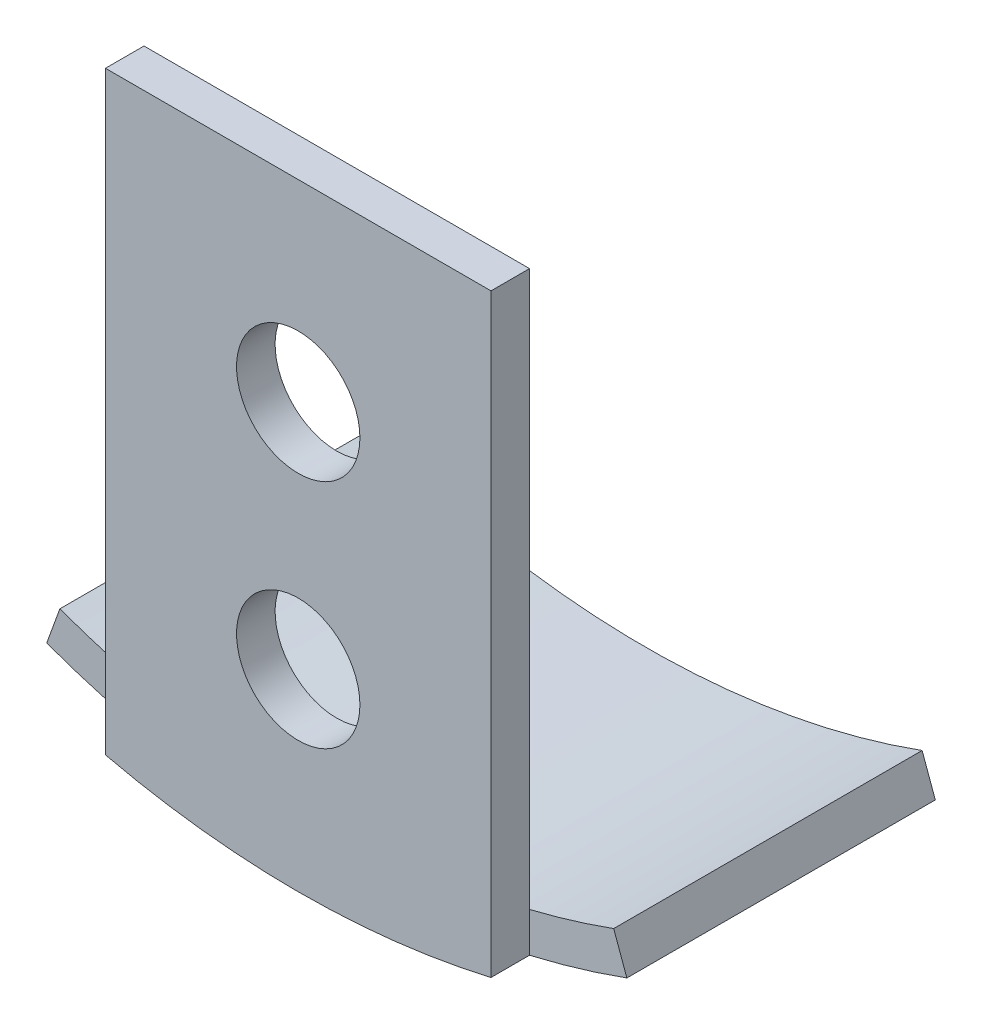
ISO-10303-21;
HEADER;
FILE_DESCRIPTION(('STEP AP214'),'2;1');
FILE_NAME('part.step','',(''),(''),'','','');
FILE_SCHEMA(('AUTOMOTIVE_DESIGN { 1 0 10303 214 1 1 1 1 }'));
ENDSEC;
DATA;
#1=APPLICATION_CONTEXT('core data for automotive mechanical design processes');
#2=APPLICATION_PROTOCOL_DEFINITION('international standard','automotive_design',2000,#1);
#3=PRODUCT_CONTEXT('',#1,'mechanical');
#4=PRODUCT('Part','Part','',(#3));
#5=PRODUCT_RELATED_PRODUCT_CATEGORY('part','',(#4));
#6=PRODUCT_DEFINITION_FORMATION('','',#4);
#7=PRODUCT_DEFINITION_CONTEXT('part definition',#1,'design');
#8=PRODUCT_DEFINITION('design','',#6,#7);
#9=PRODUCT_DEFINITION_SHAPE('','',#8);
#10=(LENGTH_UNIT() NAMED_UNIT(*) SI_UNIT(.MILLI.,.METRE.));
#11=(NAMED_UNIT(*) PLANE_ANGLE_UNIT() SI_UNIT($,.RADIAN.));
#12=(NAMED_UNIT(*) SI_UNIT($,.STERADIAN.) SOLID_ANGLE_UNIT());
#13=UNCERTAINTY_MEASURE_WITH_UNIT(LENGTH_MEASURE(1.E-05),#10,'distance_accuracy_value','');
#14=(GEOMETRIC_REPRESENTATION_CONTEXT(3) GLOBAL_UNCERTAINTY_ASSIGNED_CONTEXT((#13)) GLOBAL_UNIT_ASSIGNED_CONTEXT((#10,
#11,#12)) REPRESENTATION_CONTEXT('',''));
#15=CARTESIAN_POINT('',(0.,0.,0.));
#16=DIRECTION('',(0.,0.,1.));
#17=DIRECTION('',(1.,0.,0.));
#18=AXIS2_PLACEMENT_3D('',#15,#16,#17);
#19=CARTESIAN_POINT('',(10.,16.,0.));
#20=DIRECTION('',(0.,0.,-1.));
#21=DIRECTION('',(0.,1.,0.));
#22=AXIS2_PLACEMENT_3D('',#19,#20,#21);
#23=PLANE('',#22);
#24=CARTESIAN_POINT('',(5.,5.,0.));
#25=DIRECTION('',(0.,0.,1.));
#26=DIRECTION('',(1.,0.,0.));
#27=AXIS2_PLACEMENT_3D('',#24,#25,#26);
#28=CIRCLE('',#27,1.6);
#29=CARTESIAN_POINT('',(6.6,5.,0.));
#30=VERTEX_POINT('',#29);
#31=EDGE_CURVE('E147',#30,#30,#28,.T.);
#32=ORIENTED_EDGE('',*,*,#31,.F.);
#33=EDGE_LOOP('',(#32));
#34=FACE_BOUND('',#33,.T.);
#35=CARTESIAN_POINT('',(5.,11.,0.));
#36=DIRECTION('',(0.,0.,1.));
#37=DIRECTION('',(1.,0.,0.));
#38=AXIS2_PLACEMENT_3D('',#35,#36,#37);
#39=CIRCLE('',#38,1.6);
#40=CARTESIAN_POINT('',(6.6,11.,0.));
#41=VERTEX_POINT('',#40);
#42=EDGE_CURVE('E150',#41,#41,#39,.T.);
#43=ORIENTED_EDGE('',*,*,#42,.F.);
#44=EDGE_LOOP('',(#43));
#45=FACE_BOUND('',#44,.T.);
#46=CARTESIAN_POINT('',(5.,22.,0.));
#47=DIRECTION('',(0.,0.,-1.));
#48=DIRECTION('',(0.,1.,0.));
#49=AXIS2_PLACEMENT_3D('',#46,#47,#48);
#50=CIRCLE('',#49,22.);
#51=CARTESIAN_POINT('',(10.,0.575714714371449,0.));
#52=VERTEX_POINT('',#51);
#53=CARTESIAN_POINT('',(0.,0.575714714371449,0.));
#54=VERTEX_POINT('',#53);
#55=EDGE_CURVE('E114',#52,#54,#50,.T.);
#56=ORIENTED_EDGE('',*,*,#55,.F.);
#57=DIRECTION('',(0.,-1.,0.));
#58=VECTOR('',#57,1.);
#59=CARTESIAN_POINT('',(10.,16.,0.));
#60=LINE('',#59,#58);
#61=CARTESIAN_POINT('',(10.,16.,0.));
#62=VERTEX_POINT('',#61);
#63=EDGE_CURVE('E110',#62,#52,#60,.T.);
#64=ORIENTED_EDGE('',*,*,#63,.F.);
#65=DIRECTION('',(-1.,0.,0.));
#66=VECTOR('',#65,1.);
#67=CARTESIAN_POINT('',(10.,16.,0.));
#68=LINE('',#67,#66);
#69=CARTESIAN_POINT('',(0.,16.,0.));
#70=VERTEX_POINT('',#69);
#71=EDGE_CURVE('E157',#62,#70,#68,.T.);
#72=ORIENTED_EDGE('',*,*,#71,.T.);
#73=DIRECTION('',(0.,-1.,0.));
#74=VECTOR('',#73,1.);
#75=CARTESIAN_POINT('',(0.,16.,0.));
#76=LINE('',#75,#74);
#77=EDGE_CURVE('E158',#70,#54,#76,.T.);
#78=ORIENTED_EDGE('',*,*,#77,.T.);
#79=EDGE_LOOP('',(#56,#64,#72,#78));
#80=FACE_BOUND('',#79,.T.);
#81=ADVANCED_FACE('F34',(#34,#45,#80),#23,.F.);
#82=CARTESIAN_POINT('',(10.,0.,0.));
#83=DIRECTION('',(1.,0.,0.));
#84=DIRECTION('',(0.,0.,-1.));
#85=AXIS2_PLACEMENT_3D('',#82,#83,#84);
#86=PLANE('',#85);
#87=ORIENTED_EDGE('',*,*,#63,.T.);
#88=DIRECTION('',(0.,0.,-1.));
#89=VECTOR('',#88,1.);
#90=CARTESIAN_POINT('',(10.,0.575714714371449,7.));
#91=LINE('',#90,#89);
#92=CARTESIAN_POINT('',(10.,0.575714714371449,-1.));
#93=VERTEX_POINT('',#92);
#94=EDGE_CURVE('E104',#52,#93,#91,.T.);
#95=ORIENTED_EDGE('',*,*,#94,.T.);
#96=DIRECTION('',(0.,1.,0.));
#97=VECTOR('',#96,1.);
#98=CARTESIAN_POINT('',(10.,1.,-1.));
#99=LINE('',#98,#97);
#100=CARTESIAN_POINT('',(10.,1.60392194562886,-1.));
#101=VERTEX_POINT('',#100);
#102=EDGE_CURVE('E107',#93,#101,#99,.T.);
#103=ORIENTED_EDGE('',*,*,#102,.T.);
#104=CARTESIAN_POINT('',(10.,16.,-1.));
#105=VERTEX_POINT('',#104);
#106=EDGE_CURVE('E52',#101,#105,#99,.T.);
#107=ORIENTED_EDGE('',*,*,#106,.T.);
#108=DIRECTION('',(0.,0.,1.));
#109=VECTOR('',#108,1.);
#110=CARTESIAN_POINT('',(10.,16.,-1.));
#111=LINE('',#110,#109);
#112=EDGE_CURVE('E121',#105,#62,#111,.T.);
#113=ORIENTED_EDGE('',*,*,#112,.T.);
#114=EDGE_LOOP('',(#87,#95,#103,#107,#113));
#115=FACE_BOUND('',#114,.T.);
#116=ADVANCED_FACE('F106',(#115),#86,.T.);
#117=CARTESIAN_POINT('',(0.,0.,0.));
#118=DIRECTION('',(1.,0.,0.));
#119=DIRECTION('',(0.,0.,-1.));
#120=AXIS2_PLACEMENT_3D('',#117,#118,#119);
#121=PLANE('',#120);
#122=DIRECTION('',(0.,0.,-1.));
#123=VECTOR('',#122,1.);
#124=CARTESIAN_POINT('',(0.,0.575714714371449,7.));
#125=LINE('',#124,#123);
#126=CARTESIAN_POINT('',(0.,0.575714714371449,-1.));
#127=VERTEX_POINT('',#126);
#128=EDGE_CURVE('E201',#54,#127,#125,.T.);
#129=ORIENTED_EDGE('',*,*,#128,.F.);
#130=ORIENTED_EDGE('',*,*,#77,.F.);
#131=DIRECTION('',(0.,0.,1.));
#132=VECTOR('',#131,1.);
#133=CARTESIAN_POINT('',(0.,16.,-1.));
#134=LINE('',#133,#132);
#135=CARTESIAN_POINT('',(0.,16.,-1.));
#136=VERTEX_POINT('',#135);
#137=EDGE_CURVE('E154',#136,#70,#134,.T.);
#138=ORIENTED_EDGE('',*,*,#137,.F.);
#139=DIRECTION('',(0.,1.,0.));
#140=VECTOR('',#139,1.);
#141=CARTESIAN_POINT('',(0.,1.,-1.));
#142=LINE('',#141,#140);
#143=CARTESIAN_POINT('',(0.,1.60392194562886,-1.));
#144=VERTEX_POINT('',#143);
#145=EDGE_CURVE('E161',#144,#136,#142,.T.);
#146=ORIENTED_EDGE('',*,*,#145,.F.);
#147=EDGE_CURVE('E163',#127,#144,#142,.T.);
#148=ORIENTED_EDGE('',*,*,#147,.F.);
#149=EDGE_LOOP('',(#129,#130,#138,#146,#148));
#150=FACE_BOUND('',#149,.T.);
#151=ADVANCED_FACE('F194',(#150),#121,.F.);
#152=CARTESIAN_POINT('',(10.,1.,-1.));
#153=DIRECTION('',(0.,0.,1.));
#154=DIRECTION('',(0.,-1.,0.));
#155=AXIS2_PLACEMENT_3D('',#152,#153,#154);
#156=PLANE('',#155);
#157=CARTESIAN_POINT('',(5.,22.,-1.));
#158=DIRECTION('',(0.,0.,1.));
#159=DIRECTION('',(0.,1.,0.));
#160=AXIS2_PLACEMENT_3D('',#157,#158,#159);
#161=CIRCLE('',#160,21.);
#162=EDGE_CURVE('E12',#144,#101,#161,.T.);
#163=ORIENTED_EDGE('',*,*,#162,.F.);
#164=ORIENTED_EDGE('',*,*,#145,.T.);
#165=DIRECTION('',(-1.,0.,0.));
#166=VECTOR('',#165,1.);
#167=CARTESIAN_POINT('',(10.,16.,-1.));
#168=LINE('',#167,#166);
#169=EDGE_CURVE('E42',#105,#136,#168,.T.);
#170=ORIENTED_EDGE('',*,*,#169,.F.);
#171=ORIENTED_EDGE('',*,*,#106,.F.);
#172=EDGE_LOOP('',(#163,#164,#170,#171));
#173=FACE_BOUND('',#172,.T.);
#174=CARTESIAN_POINT('',(5.,5.,-1.));
#175=DIRECTION('',(0.,0.,1.));
#176=DIRECTION('',(0.,-1.,0.));
#177=AXIS2_PLACEMENT_3D('',#174,#175,#176);
#178=CIRCLE('',#177,1.6);
#179=CARTESIAN_POINT('',(5.,3.4,-1.));
#180=VERTEX_POINT('',#179);
#181=EDGE_CURVE('E37',#180,#180,#178,.T.);
#182=ORIENTED_EDGE('',*,*,#181,.T.);
#183=EDGE_LOOP('',(#182));
#184=FACE_BOUND('',#183,.T.);
#185=CARTESIAN_POINT('',(5.,11.,-1.));
#186=DIRECTION('',(0.,0.,1.));
#187=DIRECTION('',(0.,-1.,0.));
#188=AXIS2_PLACEMENT_3D('',#185,#186,#187);
#189=CIRCLE('',#188,1.6);
#190=CARTESIAN_POINT('',(5.,9.4,-1.));
#191=VERTEX_POINT('',#190);
#192=EDGE_CURVE('E153',#191,#191,#189,.T.);
#193=ORIENTED_EDGE('',*,*,#192,.T.);
#194=EDGE_LOOP('',(#193));
#195=FACE_BOUND('',#194,.T.);
#196=ADVANCED_FACE('F171',(#173,#184,#195),#156,.F.);
#197=CARTESIAN_POINT('',(10.,16.,-1.));
#198=DIRECTION('',(0.,-1.,0.));
#199=DIRECTION('',(0.,0.,-1.));
#200=AXIS2_PLACEMENT_3D('',#197,#198,#199);
#201=PLANE('',#200);
#202=ORIENTED_EDGE('',*,*,#137,.T.);
#203=ORIENTED_EDGE('',*,*,#71,.F.);
#204=ORIENTED_EDGE('',*,*,#112,.F.);
#205=ORIENTED_EDGE('',*,*,#169,.T.);
#206=EDGE_LOOP('',(#202,#203,#204,#205));
#207=FACE_BOUND('',#206,.T.);
#208=ADVANCED_FACE('F176',(#207),#201,.F.);
#209=CARTESIAN_POINT('',(5.,11.,-6.));
#210=DIRECTION('',(0.,0.,1.));
#211=DIRECTION('',(1.,0.,0.));
#212=AXIS2_PLACEMENT_3D('',#209,#210,#211);
#213=CYLINDRICAL_SURFACE('',#212,1.6);
#214=ORIENTED_EDGE('',*,*,#42,.T.);
#215=EDGE_LOOP('',(#214));
#216=FACE_BOUND('',#215,.T.);
#217=ORIENTED_EDGE('',*,*,#192,.F.);
#218=EDGE_LOOP('',(#217));
#219=FACE_BOUND('',#218,.T.);
#220=ADVANCED_FACE('F173',(#216,#219),#213,.F.);
#221=CARTESIAN_POINT('',(5.,5.,-6.));
#222=DIRECTION('',(0.,0.,1.));
#223=DIRECTION('',(1.,0.,0.));
#224=AXIS2_PLACEMENT_3D('',#221,#222,#223);
#225=CYLINDRICAL_SURFACE('',#224,1.6);
#226=ORIENTED_EDGE('',*,*,#31,.T.);
#227=EDGE_LOOP('',(#226));
#228=FACE_BOUND('',#227,.T.);
#229=ORIENTED_EDGE('',*,*,#181,.F.);
#230=EDGE_LOOP('',(#229));
#231=FACE_BOUND('',#230,.T.);
#232=ADVANCED_FACE('F175',(#228,#231),#225,.F.);
#233=CARTESIAN_POINT('',(5.,22.,-1.));
#234=DIRECTION('',(0.,0.,-1.));
#235=DIRECTION('',(0.,1.,0.));
#236=AXIS2_PLACEMENT_3D('',#233,#234,#235);
#237=PLANE('',#236);
#238=CARTESIAN_POINT('',(5.,22.,-1.));
#239=DIRECTION('',(0.,0.,-1.));
#240=DIRECTION('',(0.,1.,0.));
#241=AXIS2_PLACEMENT_3D('',#238,#239,#240);
#242=CIRCLE('',#241,22.);
#243=CARTESIAN_POINT('',(-2.52444315316473,1.32676234271003,-1.));
#244=VERTEX_POINT('',#243);
#245=EDGE_CURVE('E129',#127,#244,#242,.T.);
#246=ORIENTED_EDGE('',*,*,#245,.F.);
#247=ORIENTED_EDGE('',*,*,#147,.T.);
#248=CARTESIAN_POINT('',(-2.18242300983906,2.26645496349593,-1.));
#249=VERTEX_POINT('',#248);
#250=EDGE_CURVE('E44',#249,#144,#161,.T.);
#251=ORIENTED_EDGE('',*,*,#250,.F.);
#252=DIRECTION('',(0.34202014332567,0.939692620785908,0.));
#253=VECTOR('',#252,1.);
#254=CARTESIAN_POINT('',(-2.52444315316473,1.32676234271003,-1.));
#255=LINE('',#254,#253);
#256=EDGE_CURVE('E128',#244,#249,#255,.T.);
#257=ORIENTED_EDGE('',*,*,#256,.F.);
#258=EDGE_LOOP('',(#246,#247,#251,#257));
#259=FACE_BOUND('',#258,.T.);
#260=ADVANCED_FACE('F183',(#259),#237,.F.);
#261=CARTESIAN_POINT('',(5.,22.,-9.));
#262=DIRECTION('',(0.,0.,1.));
#263=DIRECTION('',(0.,-1.,0.));
#264=AXIS2_PLACEMENT_3D('',#261,#262,#263);
#265=CYLINDRICAL_SURFACE('',#264,21.);
#266=ORIENTED_EDGE('',*,*,#250,.T.);
#267=ORIENTED_EDGE('',*,*,#162,.T.);
#268=CARTESIAN_POINT('',(12.1824230098391,2.26645496349593,-1.));
#269=VERTEX_POINT('',#268);
#270=EDGE_CURVE('E45',#101,#269,#161,.T.);
#271=ORIENTED_EDGE('',*,*,#270,.T.);
#272=DIRECTION('',(0.,0.,1.));
#273=VECTOR('',#272,1.);
#274=CARTESIAN_POINT('',(12.1824230098391,2.26645496349593,-9.));
#275=LINE('',#274,#273);
#276=CARTESIAN_POINT('',(12.1824230098391,2.26645496349593,-9.));
#277=VERTEX_POINT('',#276);
#278=EDGE_CURVE('E144',#277,#269,#275,.T.);
#279=ORIENTED_EDGE('',*,*,#278,.F.);
#280=CARTESIAN_POINT('',(5.,22.,-9.));
#281=DIRECTION('',(0.,0.,1.));
#282=DIRECTION('',(0.,1.,0.));
#283=AXIS2_PLACEMENT_3D('',#280,#281,#282);
#284=CIRCLE('',#283,21.);
#285=CARTESIAN_POINT('',(-2.18242300983906,2.26645496349593,-9.));
#286=VERTEX_POINT('',#285);
#287=EDGE_CURVE('E131',#286,#277,#284,.T.);
#288=ORIENTED_EDGE('',*,*,#287,.F.);
#289=DIRECTION('',(0.,0.,1.));
#290=VECTOR('',#289,1.);
#291=CARTESIAN_POINT('',(-2.18242300983906,2.26645496349593,-9.));
#292=LINE('',#291,#290);
#293=EDGE_CURVE('E136',#286,#249,#292,.T.);
#294=ORIENTED_EDGE('',*,*,#293,.T.);
#295=EDGE_LOOP('',(#266,#267,#271,#279,#288,#294));
#296=FACE_BOUND('',#295,.T.);
#297=ADVANCED_FACE('F215',(#296),#265,.F.);
#298=CARTESIAN_POINT('',(12.1824230098391,2.26645496349593,-9.));
#299=DIRECTION('',(-0.939692620785908,-0.34202014332567,0.));
#300=DIRECTION('',(0.34202014332567,-0.939692620785908,0.));
#301=AXIS2_PLACEMENT_3D('',#298,#299,#300);
#302=PLANE('',#301);
#303=DIRECTION('',(0.34202014332567,-0.939692620785908,0.));
#304=VECTOR('',#303,1.);
#305=CARTESIAN_POINT('',(12.1824230098391,2.26645496349593,-1.));
#306=LINE('',#305,#304);
#307=CARTESIAN_POINT('',(12.5244431531647,1.32676234271002,-1.));
#308=VERTEX_POINT('',#307);
#309=EDGE_CURVE('E133',#269,#308,#306,.T.);
#310=ORIENTED_EDGE('',*,*,#309,.T.);
#311=DIRECTION('',(0.,0.,1.));
#312=VECTOR('',#311,1.);
#313=CARTESIAN_POINT('',(12.5244431531647,1.32676234271002,-9.));
#314=LINE('',#313,#312);
#315=CARTESIAN_POINT('',(12.5244431531647,1.32676234271002,-9.));
#316=VERTEX_POINT('',#315);
#317=EDGE_CURVE('E127',#316,#308,#314,.T.);
#318=ORIENTED_EDGE('',*,*,#317,.F.);
#319=DIRECTION('',(0.34202014332567,-0.939692620785908,0.));
#320=VECTOR('',#319,1.);
#321=CARTESIAN_POINT('',(12.1824230098391,2.26645496349593,-9.));
#322=LINE('',#321,#320);
#323=EDGE_CURVE('E207',#277,#316,#322,.T.);
#324=ORIENTED_EDGE('',*,*,#323,.F.);
#325=ORIENTED_EDGE('',*,*,#278,.T.);
#326=EDGE_LOOP('',(#310,#318,#324,#325));
#327=FACE_BOUND('',#326,.T.);
#328=ADVANCED_FACE('F218',(#327),#302,.F.);
#329=CARTESIAN_POINT('',(5.,22.,-9.));
#330=DIRECTION('',(0.,0.,1.));
#331=DIRECTION('',(0.,-1.,0.));
#332=AXIS2_PLACEMENT_3D('',#329,#330,#331);
#333=CYLINDRICAL_SURFACE('',#332,22.);
#334=EDGE_CURVE('E120',#308,#93,#242,.T.);
#335=ORIENTED_EDGE('',*,*,#334,.T.);
#336=ORIENTED_EDGE('',*,*,#94,.F.);
#337=ORIENTED_EDGE('',*,*,#55,.T.);
#338=ORIENTED_EDGE('',*,*,#128,.T.);
#339=ORIENTED_EDGE('',*,*,#245,.T.);
#340=DIRECTION('',(0.,0.,1.));
#341=VECTOR('',#340,1.);
#342=CARTESIAN_POINT('',(-2.52444315316473,1.32676234271003,-9.));
#343=LINE('',#342,#341);
#344=CARTESIAN_POINT('',(-2.52444315316473,1.32676234271003,-9.));
#345=VERTEX_POINT('',#344);
#346=EDGE_CURVE('E139',#345,#244,#343,.T.);
#347=ORIENTED_EDGE('',*,*,#346,.F.);
#348=CARTESIAN_POINT('',(5.,22.,-9.));
#349=DIRECTION('',(0.,0.,-1.));
#350=DIRECTION('',(0.,1.,0.));
#351=AXIS2_PLACEMENT_3D('',#348,#349,#350);
#352=CIRCLE('',#351,22.);
#353=EDGE_CURVE('E209',#316,#345,#352,.T.);
#354=ORIENTED_EDGE('',*,*,#353,.F.);
#355=ORIENTED_EDGE('',*,*,#317,.T.);
#356=EDGE_LOOP('',(#335,#336,#337,#338,#339,#347,#354,#355));
#357=FACE_BOUND('',#356,.T.);
#358=ADVANCED_FACE('F124',(#357),#333,.T.);
#359=CARTESIAN_POINT('',(-2.52444315316473,1.32676234271003,-9.));
#360=DIRECTION('',(0.939692620785908,-0.34202014332567,0.));
#361=DIRECTION('',(0.34202014332567,0.939692620785908,0.));
#362=AXIS2_PLACEMENT_3D('',#359,#360,#361);
#363=PLANE('',#362);
#364=ORIENTED_EDGE('',*,*,#256,.T.);
#365=ORIENTED_EDGE('',*,*,#293,.F.);
#366=DIRECTION('',(0.34202014332567,0.939692620785908,0.));
#367=VECTOR('',#366,1.);
#368=CARTESIAN_POINT('',(-2.52444315316473,1.32676234271003,-9.));
#369=LINE('',#368,#367);
#370=EDGE_CURVE('E140',#345,#286,#369,.T.);
#371=ORIENTED_EDGE('',*,*,#370,.F.);
#372=ORIENTED_EDGE('',*,*,#346,.T.);
#373=EDGE_LOOP('',(#364,#365,#371,#372));
#374=FACE_BOUND('',#373,.T.);
#375=ADVANCED_FACE('F263',(#374),#363,.F.);
#376=CARTESIAN_POINT('',(5.,22.,-9.));
#377=DIRECTION('',(0.,0.,-1.));
#378=DIRECTION('',(0.,1.,0.));
#379=AXIS2_PLACEMENT_3D('',#376,#377,#378);
#380=PLANE('',#379);
#381=ORIENTED_EDGE('',*,*,#287,.T.);
#382=ORIENTED_EDGE('',*,*,#323,.T.);
#383=ORIENTED_EDGE('',*,*,#353,.T.);
#384=ORIENTED_EDGE('',*,*,#370,.T.);
#385=EDGE_LOOP('',(#381,#382,#383,#384));
#386=FACE_BOUND('',#385,.T.);
#387=ADVANCED_FACE('F220',(#386),#380,.T.);
#388=ORIENTED_EDGE('',*,*,#102,.F.);
#389=ORIENTED_EDGE('',*,*,#334,.F.);
#390=ORIENTED_EDGE('',*,*,#309,.F.);
#391=ORIENTED_EDGE('',*,*,#270,.F.);
#392=EDGE_LOOP('',(#388,#389,#390,#391));
#393=FACE_BOUND('',#392,.T.);
#394=ADVANCED_FACE('F118',(#393),#237,.F.);
#395=CLOSED_SHELL('',(#81,#116,#151,#196,#208,#220,#232,#260,#297,#328,#358,#375,#387,#394));
#396=MANIFOLD_SOLID_BREP('B2',#395);
#397=ADVANCED_BREP_SHAPE_REPRESENTATION('',(#18,#396),#14);
#398=SHAPE_DEFINITION_REPRESENTATION(#9,#397);
ENDSEC;
END-ISO-10303-21;
